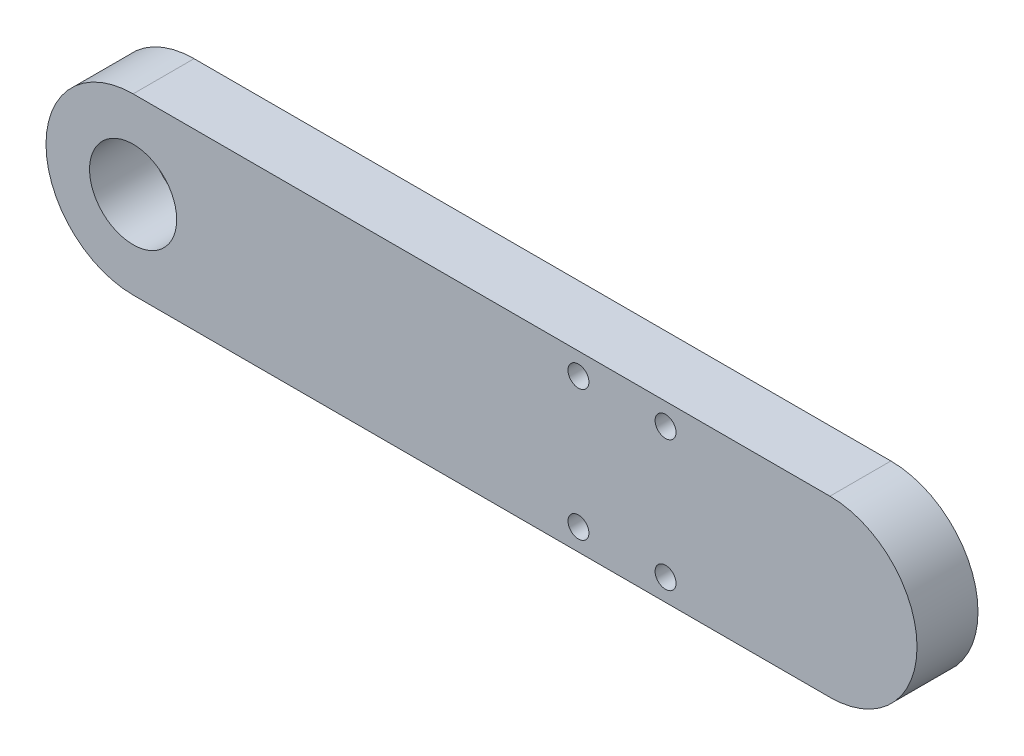
ISO-10303-21;
HEADER;
FILE_DESCRIPTION(('STEP AP214'),'2;1');
FILE_NAME('part.step','',(''),(''),'','','');
FILE_SCHEMA(('AUTOMOTIVE_DESIGN { 1 0 10303 214 1 1 1 1 }'));
ENDSEC;
DATA;
#1=APPLICATION_CONTEXT('core data for automotive mechanical design processes');
#2=APPLICATION_PROTOCOL_DEFINITION('international standard','automotive_design',2000,#1);
#3=PRODUCT_CONTEXT('',#1,'mechanical');
#4=PRODUCT('Part','Part','',(#3));
#5=PRODUCT_RELATED_PRODUCT_CATEGORY('part','',(#4));
#6=PRODUCT_DEFINITION_FORMATION('','',#4);
#7=PRODUCT_DEFINITION_CONTEXT('part definition',#1,'design');
#8=PRODUCT_DEFINITION('design','',#6,#7);
#9=PRODUCT_DEFINITION_SHAPE('','',#8);
#10=(LENGTH_UNIT() NAMED_UNIT(*) SI_UNIT(.MILLI.,.METRE.));
#11=(NAMED_UNIT(*) PLANE_ANGLE_UNIT() SI_UNIT($,.RADIAN.));
#12=(NAMED_UNIT(*) SI_UNIT($,.STERADIAN.) SOLID_ANGLE_UNIT());
#13=UNCERTAINTY_MEASURE_WITH_UNIT(LENGTH_MEASURE(1.E-05),#10,'distance_accuracy_value','');
#14=(GEOMETRIC_REPRESENTATION_CONTEXT(3) GLOBAL_UNCERTAINTY_ASSIGNED_CONTEXT((#13)) GLOBAL_UNIT_ASSIGNED_CONTEXT((#10,
#11,#12)) REPRESENTATION_CONTEXT('',''));
#15=CARTESIAN_POINT('',(0.,0.,0.));
#16=DIRECTION('',(0.,0.,1.));
#17=DIRECTION('',(1.,0.,0.));
#18=AXIS2_PLACEMENT_3D('',#15,#16,#17);
#19=CARTESIAN_POINT('',(0.,0.,7.));
#20=DIRECTION('',(0.,0.,-1.));
#21=DIRECTION('',(-1.,0.,0.));
#22=AXIS2_PLACEMENT_3D('',#19,#20,#21);
#23=CYLINDRICAL_SURFACE('',#22,10.);
#24=CARTESIAN_POINT('',(0.,0.,0.));
#25=DIRECTION('',(0.,0.,1.));
#26=DIRECTION('',(1.,0.,0.));
#27=AXIS2_PLACEMENT_3D('',#24,#25,#26);
#28=CIRCLE('',#27,10.);
#29=CARTESIAN_POINT('',(0.,10.,0.));
#30=VERTEX_POINT('',#29);
#31=CARTESIAN_POINT('',(0.,-10.,0.));
#32=VERTEX_POINT('',#31);
#33=EDGE_CURVE('E108',#30,#32,#28,.T.);
#34=ORIENTED_EDGE('',*,*,#33,.T.);
#35=DIRECTION('',(0.,0.,-1.));
#36=VECTOR('',#35,1.);
#37=CARTESIAN_POINT('',(0.,-10.,7.));
#38=LINE('',#37,#36);
#39=CARTESIAN_POINT('',(0.,-10.,7.));
#40=VERTEX_POINT('',#39);
#41=EDGE_CURVE('E11',#40,#32,#38,.T.);
#42=ORIENTED_EDGE('',*,*,#41,.F.);
#43=CARTESIAN_POINT('',(0.,0.,7.));
#44=DIRECTION('',(0.,0.,1.));
#45=DIRECTION('',(1.,0.,0.));
#46=AXIS2_PLACEMENT_3D('',#43,#44,#45);
#47=CIRCLE('',#46,10.);
#48=CARTESIAN_POINT('',(0.,10.,7.));
#49=VERTEX_POINT('',#48);
#50=EDGE_CURVE('E91',#49,#40,#47,.T.);
#51=ORIENTED_EDGE('',*,*,#50,.F.);
#52=DIRECTION('',(0.,0.,-1.));
#53=VECTOR('',#52,1.);
#54=CARTESIAN_POINT('',(0.,10.,7.));
#55=LINE('',#54,#53);
#56=EDGE_CURVE('E58',#49,#30,#55,.T.);
#57=ORIENTED_EDGE('',*,*,#56,.T.);
#58=EDGE_LOOP('',(#34,#42,#51,#57));
#59=FACE_BOUND('',#58,.T.);
#60=ADVANCED_FACE('F41',(#59),#23,.T.);
#61=CARTESIAN_POINT('',(0.,-10.,7.));
#62=DIRECTION('',(0.,1.,0.));
#63=DIRECTION('',(0.,0.,1.));
#64=AXIS2_PLACEMENT_3D('',#61,#62,#63);
#65=PLANE('',#64);
#66=DIRECTION('',(1.,0.,0.));
#67=VECTOR('',#66,1.);
#68=CARTESIAN_POINT('',(0.,-10.,0.));
#69=LINE('',#68,#67);
#70=CARTESIAN_POINT('',(80.,-10.,0.));
#71=VERTEX_POINT('',#70);
#72=EDGE_CURVE('E96',#32,#71,#69,.T.);
#73=ORIENTED_EDGE('',*,*,#72,.T.);
#74=DIRECTION('',(0.,0.,-1.));
#75=VECTOR('',#74,1.);
#76=CARTESIAN_POINT('',(80.,-10.,7.));
#77=LINE('',#76,#75);
#78=CARTESIAN_POINT('',(80.,-10.,7.));
#79=VERTEX_POINT('',#78);
#80=EDGE_CURVE('E50',#79,#71,#77,.T.);
#81=ORIENTED_EDGE('',*,*,#80,.F.);
#82=DIRECTION('',(1.,0.,0.));
#83=VECTOR('',#82,1.);
#84=CARTESIAN_POINT('',(0.,-10.,7.));
#85=LINE('',#84,#83);
#86=EDGE_CURVE('E84',#40,#79,#85,.T.);
#87=ORIENTED_EDGE('',*,*,#86,.F.);
#88=ORIENTED_EDGE('',*,*,#41,.T.);
#89=EDGE_LOOP('',(#73,#81,#87,#88));
#90=FACE_BOUND('',#89,.T.);
#91=ADVANCED_FACE('F95',(#90),#65,.F.);
#92=CARTESIAN_POINT('',(80.,0.,7.));
#93=DIRECTION('',(0.,0.,-1.));
#94=DIRECTION('',(-1.,0.,0.));
#95=AXIS2_PLACEMENT_3D('',#92,#93,#94);
#96=CYLINDRICAL_SURFACE('',#95,10.);
#97=CARTESIAN_POINT('',(80.,0.,0.));
#98=DIRECTION('',(0.,0.,1.));
#99=DIRECTION('',(1.,0.,0.));
#100=AXIS2_PLACEMENT_3D('',#97,#98,#99);
#101=CIRCLE('',#100,10.);
#102=CARTESIAN_POINT('',(80.,10.,0.));
#103=VERTEX_POINT('',#102);
#104=EDGE_CURVE('E112',#71,#103,#101,.T.);
#105=ORIENTED_EDGE('',*,*,#104,.T.);
#106=DIRECTION('',(0.,0.,-1.));
#107=VECTOR('',#106,1.);
#108=CARTESIAN_POINT('',(80.,10.,7.));
#109=LINE('',#108,#107);
#110=CARTESIAN_POINT('',(80.,10.,7.));
#111=VERTEX_POINT('',#110);
#112=EDGE_CURVE('E73',#111,#103,#109,.T.);
#113=ORIENTED_EDGE('',*,*,#112,.F.);
#114=CARTESIAN_POINT('',(80.,0.,7.));
#115=DIRECTION('',(0.,0.,1.));
#116=DIRECTION('',(1.,0.,0.));
#117=AXIS2_PLACEMENT_3D('',#114,#115,#116);
#118=CIRCLE('',#117,10.);
#119=EDGE_CURVE('E90',#79,#111,#118,.T.);
#120=ORIENTED_EDGE('',*,*,#119,.F.);
#121=ORIENTED_EDGE('',*,*,#80,.T.);
#122=EDGE_LOOP('',(#105,#113,#120,#121));
#123=FACE_BOUND('',#122,.T.);
#124=ADVANCED_FACE('F99',(#123),#96,.T.);
#125=CARTESIAN_POINT('',(0.,0.,7.));
#126=DIRECTION('',(0.,0.,-1.));
#127=DIRECTION('',(-1.,0.,0.));
#128=AXIS2_PLACEMENT_3D('',#125,#126,#127);
#129=CYLINDRICAL_SURFACE('',#128,5.);
#130=CARTESIAN_POINT('',(0.,0.,7.));
#131=DIRECTION('',(0.,0.,1.));
#132=DIRECTION('',(1.,0.,0.));
#133=AXIS2_PLACEMENT_3D('',#130,#131,#132);
#134=CIRCLE('',#133,5.);
#135=CARTESIAN_POINT('',(5.,0.,7.));
#136=VERTEX_POINT('',#135);
#137=EDGE_CURVE('E117',#136,#136,#134,.T.);
#138=ORIENTED_EDGE('',*,*,#137,.T.);
#139=EDGE_LOOP('',(#138));
#140=FACE_BOUND('',#139,.T.);
#141=CARTESIAN_POINT('',(0.,0.,0.));
#142=DIRECTION('',(0.,0.,1.));
#143=DIRECTION('',(1.,0.,0.));
#144=AXIS2_PLACEMENT_3D('',#141,#142,#143);
#145=CIRCLE('',#144,5.);
#146=CARTESIAN_POINT('',(5.,0.,0.));
#147=VERTEX_POINT('',#146);
#148=EDGE_CURVE('E105',#147,#147,#145,.T.);
#149=ORIENTED_EDGE('',*,*,#148,.F.);
#150=EDGE_LOOP('',(#149));
#151=FACE_BOUND('',#150,.T.);
#152=ADVANCED_FACE('F43',(#140,#151),#129,.F.);
#153=CARTESIAN_POINT('',(0.,10.,7.));
#154=DIRECTION('',(0.,1.,0.));
#155=DIRECTION('',(0.,0.,1.));
#156=AXIS2_PLACEMENT_3D('',#153,#154,#155);
#157=PLANE('',#156);
#158=DIRECTION('',(1.,0.,0.));
#159=VECTOR('',#158,1.);
#160=CARTESIAN_POINT('',(0.,10.,0.));
#161=LINE('',#160,#159);
#162=EDGE_CURVE('E114',#30,#103,#161,.T.);
#163=ORIENTED_EDGE('',*,*,#162,.F.);
#164=ORIENTED_EDGE('',*,*,#56,.F.);
#165=DIRECTION('',(1.,0.,0.));
#166=VECTOR('',#165,1.);
#167=CARTESIAN_POINT('',(0.,10.,7.));
#168=LINE('',#167,#166);
#169=EDGE_CURVE('E100',#49,#111,#168,.T.);
#170=ORIENTED_EDGE('',*,*,#169,.T.);
#171=ORIENTED_EDGE('',*,*,#112,.T.);
#172=EDGE_LOOP('',(#163,#164,#170,#171));
#173=FACE_BOUND('',#172,.T.);
#174=ADVANCED_FACE('F160',(#173),#157,.T.);
#175=CARTESIAN_POINT('',(0.,0.,7.));
#176=DIRECTION('',(0.,0.,1.));
#177=DIRECTION('',(1.,0.,0.));
#178=AXIS2_PLACEMENT_3D('',#175,#176,#177);
#179=PLANE('',#178);
#180=CARTESIAN_POINT('',(51.129038153427,7.49999999999295,7.));
#181=DIRECTION('',(0.,0.,1.));
#182=DIRECTION('',(1.,0.,0.));
#183=AXIS2_PLACEMENT_3D('',#180,#181,#182);
#184=CIRCLE('',#183,1.19999999999999);
#185=CARTESIAN_POINT('',(52.329038153427,7.49999999999295,7.));
#186=VERTEX_POINT('',#185);
#187=EDGE_CURVE('E109',#186,#186,#184,.T.);
#188=ORIENTED_EDGE('',*,*,#187,.F.);
#189=EDGE_LOOP('',(#188));
#190=FACE_BOUND('',#189,.T.);
#191=CARTESIAN_POINT('',(61.129038153427,7.49999999999295,7.));
#192=DIRECTION('',(0.,0.,1.));
#193=DIRECTION('',(1.,0.,0.));
#194=AXIS2_PLACEMENT_3D('',#191,#192,#193);
#195=CIRCLE('',#194,1.2);
#196=CARTESIAN_POINT('',(62.329038153427,7.49999999999295,7.));
#197=VERTEX_POINT('',#196);
#198=EDGE_CURVE('E127',#197,#197,#195,.T.);
#199=ORIENTED_EDGE('',*,*,#198,.F.);
#200=EDGE_LOOP('',(#199));
#201=FACE_BOUND('',#200,.T.);
#202=CARTESIAN_POINT('',(61.129038153427,-7.50000000000705,7.));
#203=DIRECTION('',(0.,0.,1.));
#204=DIRECTION('',(1.,0.,0.));
#205=AXIS2_PLACEMENT_3D('',#202,#203,#204);
#206=CIRCLE('',#205,1.2);
#207=CARTESIAN_POINT('',(62.329038153427,-7.50000000000705,7.));
#208=VERTEX_POINT('',#207);
#209=EDGE_CURVE('E130',#208,#208,#206,.T.);
#210=ORIENTED_EDGE('',*,*,#209,.F.);
#211=EDGE_LOOP('',(#210));
#212=FACE_BOUND('',#211,.T.);
#213=CARTESIAN_POINT('',(51.129038153427,-7.50000000000705,7.));
#214=DIRECTION('',(0.,0.,1.));
#215=DIRECTION('',(1.,0.,0.));
#216=AXIS2_PLACEMENT_3D('',#213,#214,#215);
#217=CIRCLE('',#216,1.20000000000001);
#218=CARTESIAN_POINT('',(52.329038153427,-7.50000000000705,7.));
#219=VERTEX_POINT('',#218);
#220=EDGE_CURVE('E133',#219,#219,#217,.T.);
#221=ORIENTED_EDGE('',*,*,#220,.F.);
#222=EDGE_LOOP('',(#221));
#223=FACE_BOUND('',#222,.T.);
#224=ORIENTED_EDGE('',*,*,#137,.F.);
#225=EDGE_LOOP('',(#224));
#226=FACE_BOUND('',#225,.T.);
#227=ORIENTED_EDGE('',*,*,#50,.T.);
#228=ORIENTED_EDGE('',*,*,#86,.T.);
#229=ORIENTED_EDGE('',*,*,#119,.T.);
#230=ORIENTED_EDGE('',*,*,#169,.F.);
#231=EDGE_LOOP('',(#227,#228,#229,#230));
#232=FACE_BOUND('',#231,.T.);
#233=ADVANCED_FACE('F87',(#190,#201,#212,#223,#226,#232),#179,.T.);
#234=CARTESIAN_POINT('',(0.,0.,0.));
#235=DIRECTION('',(0.,0.,1.));
#236=DIRECTION('',(1.,0.,0.));
#237=AXIS2_PLACEMENT_3D('',#234,#235,#236);
#238=PLANE('',#237);
#239=CARTESIAN_POINT('',(51.129038153427,7.49999999999295,0.));
#240=DIRECTION('',(0.,0.,-1.));
#241=DIRECTION('',(-1.,0.,0.));
#242=AXIS2_PLACEMENT_3D('',#239,#240,#241);
#243=CIRCLE('',#242,1.19999999999999);
#244=CARTESIAN_POINT('',(49.929038153427,7.49999999999295,0.));
#245=VERTEX_POINT('',#244);
#246=EDGE_CURVE('E140',#245,#245,#243,.T.);
#247=ORIENTED_EDGE('',*,*,#246,.F.);
#248=EDGE_LOOP('',(#247));
#249=FACE_BOUND('',#248,.T.);
#250=CARTESIAN_POINT('',(61.129038153427,7.49999999999295,0.));
#251=DIRECTION('',(0.,0.,-1.));
#252=DIRECTION('',(-1.,0.,0.));
#253=AXIS2_PLACEMENT_3D('',#250,#251,#252);
#254=CIRCLE('',#253,1.2);
#255=CARTESIAN_POINT('',(59.929038153427,7.49999999999295,0.));
#256=VERTEX_POINT('',#255);
#257=EDGE_CURVE('E143',#256,#256,#254,.T.);
#258=ORIENTED_EDGE('',*,*,#257,.F.);
#259=EDGE_LOOP('',(#258));
#260=FACE_BOUND('',#259,.T.);
#261=CARTESIAN_POINT('',(61.129038153427,-7.50000000000705,0.));
#262=DIRECTION('',(0.,0.,-1.));
#263=DIRECTION('',(-1.,0.,0.));
#264=AXIS2_PLACEMENT_3D('',#261,#262,#263);
#265=CIRCLE('',#264,1.2);
#266=CARTESIAN_POINT('',(59.929038153427,-7.50000000000705,0.));
#267=VERTEX_POINT('',#266);
#268=EDGE_CURVE('E139',#267,#267,#265,.T.);
#269=ORIENTED_EDGE('',*,*,#268,.F.);
#270=EDGE_LOOP('',(#269));
#271=FACE_BOUND('',#270,.T.);
#272=CARTESIAN_POINT('',(51.129038153427,-7.50000000000705,0.));
#273=DIRECTION('',(0.,0.,-1.));
#274=DIRECTION('',(-1.,0.,0.));
#275=AXIS2_PLACEMENT_3D('',#272,#273,#274);
#276=CIRCLE('',#275,1.20000000000001);
#277=CARTESIAN_POINT('',(49.929038153427,-7.50000000000705,0.));
#278=VERTEX_POINT('',#277);
#279=EDGE_CURVE('E136',#278,#278,#276,.T.);
#280=ORIENTED_EDGE('',*,*,#279,.F.);
#281=EDGE_LOOP('',(#280));
#282=FACE_BOUND('',#281,.T.);
#283=ORIENTED_EDGE('',*,*,#148,.T.);
#284=EDGE_LOOP('',(#283));
#285=FACE_BOUND('',#284,.T.);
#286=ORIENTED_EDGE('',*,*,#33,.F.);
#287=ORIENTED_EDGE('',*,*,#162,.T.);
#288=ORIENTED_EDGE('',*,*,#104,.F.);
#289=ORIENTED_EDGE('',*,*,#72,.F.);
#290=EDGE_LOOP('',(#286,#287,#288,#289));
#291=FACE_BOUND('',#290,.T.);
#292=ADVANCED_FACE('F151',(#249,#260,#271,#282,#285,#291),#238,.F.);
#293=CARTESIAN_POINT('',(51.129038153427,-7.50000000000705,10.));
#294=DIRECTION('',(0.,0.,-1.));
#295=DIRECTION('',(-1.,0.,0.));
#296=AXIS2_PLACEMENT_3D('',#293,#294,#295);
#297=CYLINDRICAL_SURFACE('',#296,1.20000000000001);
#298=ORIENTED_EDGE('',*,*,#220,.T.);
#299=EDGE_LOOP('',(#298));
#300=FACE_BOUND('',#299,.T.);
#301=ORIENTED_EDGE('',*,*,#279,.T.);
#302=EDGE_LOOP('',(#301));
#303=FACE_BOUND('',#302,.T.);
#304=ADVANCED_FACE('F154',(#300,#303),#297,.F.);
#305=CARTESIAN_POINT('',(61.129038153427,-7.50000000000705,10.));
#306=DIRECTION('',(0.,0.,-1.));
#307=DIRECTION('',(-1.,0.,0.));
#308=AXIS2_PLACEMENT_3D('',#305,#306,#307);
#309=CYLINDRICAL_SURFACE('',#308,1.2);
#310=ORIENTED_EDGE('',*,*,#209,.T.);
#311=EDGE_LOOP('',(#310));
#312=FACE_BOUND('',#311,.T.);
#313=ORIENTED_EDGE('',*,*,#268,.T.);
#314=EDGE_LOOP('',(#313));
#315=FACE_BOUND('',#314,.T.);
#316=ADVANCED_FACE('F149',(#312,#315),#309,.F.);
#317=CARTESIAN_POINT('',(61.129038153427,7.49999999999295,10.));
#318=DIRECTION('',(0.,0.,-1.));
#319=DIRECTION('',(-1.,0.,0.));
#320=AXIS2_PLACEMENT_3D('',#317,#318,#319);
#321=CYLINDRICAL_SURFACE('',#320,1.2);
#322=ORIENTED_EDGE('',*,*,#198,.T.);
#323=EDGE_LOOP('',(#322));
#324=FACE_BOUND('',#323,.T.);
#325=ORIENTED_EDGE('',*,*,#257,.T.);
#326=EDGE_LOOP('',(#325));
#327=FACE_BOUND('',#326,.T.);
#328=ADVANCED_FACE('F218',(#324,#327),#321,.F.);
#329=CARTESIAN_POINT('',(51.129038153427,7.49999999999295,10.));
#330=DIRECTION('',(0.,0.,-1.));
#331=DIRECTION('',(-1.,0.,0.));
#332=AXIS2_PLACEMENT_3D('',#329,#330,#331);
#333=CYLINDRICAL_SURFACE('',#332,1.19999999999999);
#334=ORIENTED_EDGE('',*,*,#187,.T.);
#335=EDGE_LOOP('',(#334));
#336=FACE_BOUND('',#335,.T.);
#337=ORIENTED_EDGE('',*,*,#246,.T.);
#338=EDGE_LOOP('',(#337));
#339=FACE_BOUND('',#338,.T.);
#340=ADVANCED_FACE('F229',(#336,#339),#333,.F.);
#341=CLOSED_SHELL('',(#60,#91,#124,#152,#174,#233,#292,#304,#316,#328,#340));
#342=MANIFOLD_SOLID_BREP('B2',#341);
#343=ADVANCED_BREP_SHAPE_REPRESENTATION('',(#18,#342),#14);
#344=SHAPE_DEFINITION_REPRESENTATION(#9,#343);
ENDSEC;
END-ISO-10303-21;
